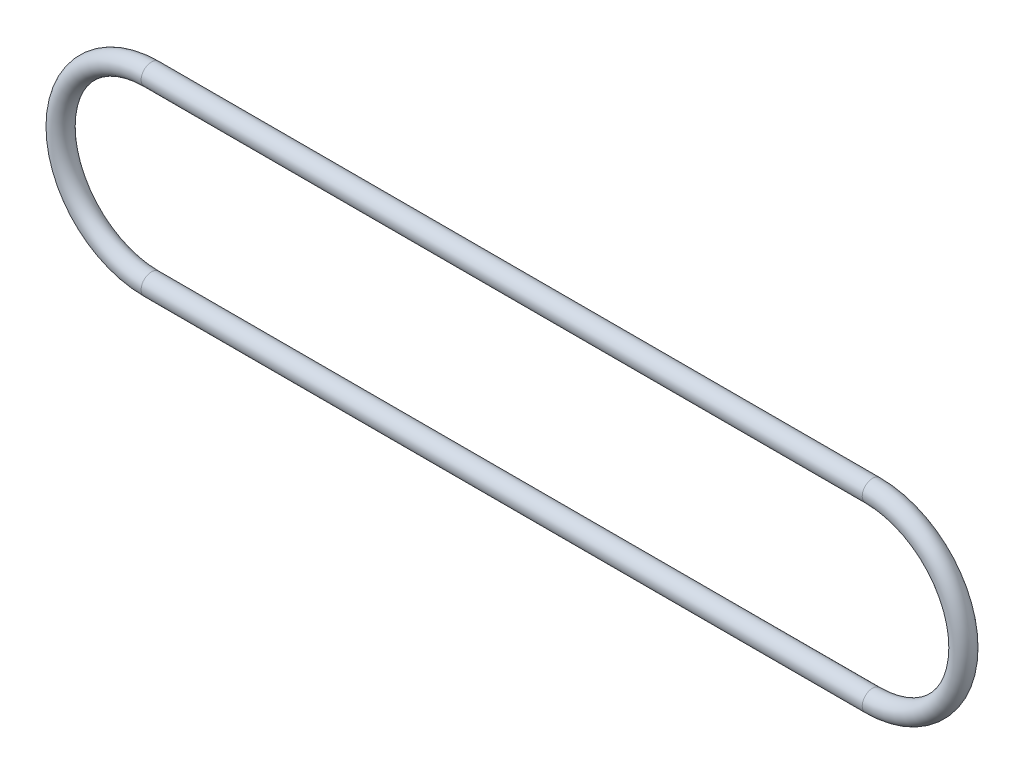
ISO-10303-21;
HEADER;
FILE_DESCRIPTION(('STEP AP214'),'2;1');
FILE_NAME('part.step','',(''),(''),'','','');
FILE_SCHEMA(('AUTOMOTIVE_DESIGN { 1 0 10303 214 1 1 1 1 }'));
ENDSEC;
DATA;
#1=APPLICATION_CONTEXT('core data for automotive mechanical design processes');
#2=APPLICATION_PROTOCOL_DEFINITION('international standard','automotive_design',2000,#1);
#3=PRODUCT_CONTEXT('',#1,'mechanical');
#4=PRODUCT('Part','Part','',(#3));
#5=PRODUCT_RELATED_PRODUCT_CATEGORY('part','',(#4));
#6=PRODUCT_DEFINITION_FORMATION('','',#4);
#7=PRODUCT_DEFINITION_CONTEXT('part definition',#1,'design');
#8=PRODUCT_DEFINITION('design','',#6,#7);
#9=PRODUCT_DEFINITION_SHAPE('','',#8);
#10=(LENGTH_UNIT() NAMED_UNIT(*) SI_UNIT(.MILLI.,.METRE.));
#11=(NAMED_UNIT(*) PLANE_ANGLE_UNIT() SI_UNIT($,.RADIAN.));
#12=(NAMED_UNIT(*) SI_UNIT($,.STERADIAN.) SOLID_ANGLE_UNIT());
#13=UNCERTAINTY_MEASURE_WITH_UNIT(LENGTH_MEASURE(1.E-05),#10,'distance_accuracy_value','');
#14=(GEOMETRIC_REPRESENTATION_CONTEXT(3) GLOBAL_UNCERTAINTY_ASSIGNED_CONTEXT((#13)) GLOBAL_UNIT_ASSIGNED_CONTEXT((#10,
#11,#12)) REPRESENTATION_CONTEXT('',''));
#15=CARTESIAN_POINT('',(0.,0.,0.));
#16=DIRECTION('',(0.,0.,1.));
#17=DIRECTION('',(1.,0.,0.));
#18=AXIS2_PLACEMENT_3D('',#15,#16,#17);
#19=CARTESIAN_POINT('',(626.503092783505,161.559793814433,0.));
#20=DIRECTION('',(0.,0.,-1.));
#21=DIRECTION('',(-1.,0.,0.));
#22=AXIS2_PLACEMENT_3D('',#19,#20,#21);
#23=TOROIDAL_SURFACE('',#22,110.,12.5);
#24=CARTESIAN_POINT('',(626.503092783505,271.559793814433,0.));
#25=DIRECTION('',(-1.,0.,0.));
#26=DIRECTION('',(0.,-1.,0.));
#27=AXIS2_PLACEMENT_3D('',#24,#25,#26);
#28=CIRCLE('',#27,12.5);
#29=CARTESIAN_POINT('',(626.503092783505,284.059793814433,0.));
#30=VERTEX_POINT('',#29);
#31=EDGE_CURVE('E64',#30,#30,#28,.T.);
#32=CARTESIAN_POINT('',(626.503092783505,51.5597938144329,0.));
#33=DIRECTION('',(1.,0.,0.));
#34=DIRECTION('',(0.,1.,0.));
#35=AXIS2_PLACEMENT_3D('',#32,#33,#34);
#36=CIRCLE('',#35,12.5);
#37=CARTESIAN_POINT('',(626.503092783505,39.0597938144329,0.));
#38=VERTEX_POINT('',#37);
#39=EDGE_CURVE('E60',#38,#38,#36,.T.);
#40=CARTESIAN_POINT('',(626.503092783505,161.559793814433,0.));
#41=DIRECTION('',(0.,0.,-1.));
#42=DIRECTION('',(-1.,0.,0.));
#43=AXIS2_PLACEMENT_3D('',#40,#41,#42);
#44=CIRCLE('',#43,122.5);
#45=EDGE_CURVE('',#30,#38,#44,.T.);
#46=ORIENTED_EDGE('',*,*,#31,.F.);
#47=ORIENTED_EDGE('',*,*,#39,.T.);
#48=ORIENTED_EDGE('',*,*,#45,.T.);
#49=ORIENTED_EDGE('',*,*,#45,.F.);
#50=EDGE_LOOP('',(#46,#48,#47,#49));
#51=FACE_BOUND('',#50,.T.);
#52=ADVANCED_FACE('F49',(#51),#23,.T.);
#53=CARTESIAN_POINT('',(626.503092783505,51.5597938144329,0.));
#54=DIRECTION('',(-1.,0.,0.));
#55=DIRECTION('',(0.,0.,1.));
#56=AXIS2_PLACEMENT_3D('',#53,#54,#55);
#57=CYLINDRICAL_SURFACE('',#56,12.5);
#58=CARTESIAN_POINT('',(-246.496907216495,51.5597938144329,0.));
#59=DIRECTION('',(1.,0.,0.));
#60=DIRECTION('',(0.,1.,0.));
#61=AXIS2_PLACEMENT_3D('',#58,#59,#60);
#62=CIRCLE('',#61,12.5);
#63=CARTESIAN_POINT('',(-246.496907216495,39.0597938144329,0.));
#64=VERTEX_POINT('',#63);
#65=EDGE_CURVE('E56',#64,#64,#62,.T.);
#66=ORIENTED_EDGE('',*,*,#65,.T.);
#67=EDGE_LOOP('',(#66));
#68=FACE_BOUND('',#67,.T.);
#69=ORIENTED_EDGE('',*,*,#39,.F.);
#70=EDGE_LOOP('',(#69));
#71=FACE_BOUND('',#70,.T.);
#72=ADVANCED_FACE('F73',(#68,#71),#57,.T.);
#73=CARTESIAN_POINT('',(-246.496907216495,161.559793814433,0.));
#74=DIRECTION('',(0.,0.,-1.));
#75=DIRECTION('',(-1.,0.,0.));
#76=AXIS2_PLACEMENT_3D('',#73,#74,#75);
#77=TOROIDAL_SURFACE('',#76,110.,12.5);
#78=CARTESIAN_POINT('',(-246.496907216495,271.559793814432,0.));
#79=DIRECTION('',(-1.,0.,0.));
#80=DIRECTION('',(0.,-1.,0.));
#81=AXIS2_PLACEMENT_3D('',#78,#79,#80);
#82=CIRCLE('',#81,12.5);
#83=CARTESIAN_POINT('',(-246.496907216495,284.059793814432,0.));
#84=VERTEX_POINT('',#83);
#85=EDGE_CURVE('E11',#84,#84,#82,.T.);
#86=CARTESIAN_POINT('',(-246.496907216495,161.559793814433,0.));
#87=DIRECTION('',(0.,0.,-1.));
#88=DIRECTION('',(-1.,0.,0.));
#89=AXIS2_PLACEMENT_3D('',#86,#87,#88);
#90=CIRCLE('',#89,122.5);
#91=EDGE_CURVE('',#64,#84,#90,.T.);
#92=ORIENTED_EDGE('',*,*,#65,.F.);
#93=ORIENTED_EDGE('',*,*,#85,.T.);
#94=ORIENTED_EDGE('',*,*,#91,.T.);
#95=ORIENTED_EDGE('',*,*,#91,.F.);
#96=EDGE_LOOP('',(#92,#94,#93,#95));
#97=FACE_BOUND('',#96,.T.);
#98=ADVANCED_FACE('F79',(#97),#77,.T.);
#99=CARTESIAN_POINT('',(-246.496907216495,271.559793814432,0.));
#100=DIRECTION('',(1.,0.,0.));
#101=DIRECTION('',(0.,1.,0.));
#102=AXIS2_PLACEMENT_3D('',#99,#100,#101);
#103=CYLINDRICAL_SURFACE('',#102,12.5);
#104=ORIENTED_EDGE('',*,*,#31,.T.);
#105=EDGE_LOOP('',(#104));
#106=FACE_BOUND('',#105,.T.);
#107=ORIENTED_EDGE('',*,*,#85,.F.);
#108=EDGE_LOOP('',(#107));
#109=FACE_BOUND('',#108,.T.);
#110=ADVANCED_FACE('F51',(#106,#109),#103,.T.);
#111=CLOSED_SHELL('',(#52,#72,#98,#110));
#112=MANIFOLD_SOLID_BREP('B2',#111);
#113=ADVANCED_BREP_SHAPE_REPRESENTATION('',(#18,#112),#14);
#114=SHAPE_DEFINITION_REPRESENTATION(#9,#113);
ENDSEC;
END-ISO-10303-21;
